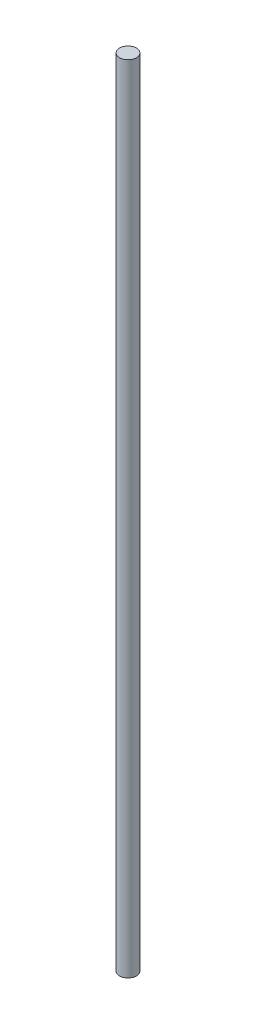
ISO-10303-21;
HEADER;
FILE_DESCRIPTION(('STEP AP214'),'2;1');
FILE_NAME('part.step','',(''),(''),'','','');
FILE_SCHEMA(('AUTOMOTIVE_DESIGN { 1 0 10303 214 1 1 1 1 }'));
ENDSEC;
DATA;
#1=APPLICATION_CONTEXT('core data for automotive mechanical design processes');
#2=APPLICATION_PROTOCOL_DEFINITION('international standard','automotive_design',2000,#1);
#3=PRODUCT_CONTEXT('',#1,'mechanical');
#4=PRODUCT('Part','Part','',(#3));
#5=PRODUCT_RELATED_PRODUCT_CATEGORY('part','',(#4));
#6=PRODUCT_DEFINITION_FORMATION('','',#4);
#7=PRODUCT_DEFINITION_CONTEXT('part definition',#1,'design');
#8=PRODUCT_DEFINITION('design','',#6,#7);
#9=PRODUCT_DEFINITION_SHAPE('','',#8);
#10=(LENGTH_UNIT() NAMED_UNIT(*) SI_UNIT(.MILLI.,.METRE.));
#11=(NAMED_UNIT(*) PLANE_ANGLE_UNIT() SI_UNIT($,.RADIAN.));
#12=(NAMED_UNIT(*) SI_UNIT($,.STERADIAN.) SOLID_ANGLE_UNIT());
#13=UNCERTAINTY_MEASURE_WITH_UNIT(LENGTH_MEASURE(1.E-05),#10,'distance_accuracy_value','');
#14=(GEOMETRIC_REPRESENTATION_CONTEXT(3) GLOBAL_UNCERTAINTY_ASSIGNED_CONTEXT((#13)) GLOBAL_UNIT_ASSIGNED_CONTEXT((#10,
#11,#12)) REPRESENTATION_CONTEXT('',''));
#15=CARTESIAN_POINT('',(0.,0.,0.));
#16=DIRECTION('',(0.,0.,1.));
#17=DIRECTION('',(1.,0.,0.));
#18=AXIS2_PLACEMENT_3D('',#15,#16,#17);
#19=CARTESIAN_POINT('',(-8.5683409021784,377.5,-5.41821557049514));
#20=DIRECTION('',(0.,-1.,0.));
#21=DIRECTION('',(0.,0.,-1.));
#22=AXIS2_PLACEMENT_3D('',#19,#20,#21);
#23=CYLINDRICAL_SURFACE('',#22,4.);
#24=CARTESIAN_POINT('',(-8.5683409021784,377.5,-5.41821557049514));
#25=DIRECTION('',(0.,1.,0.));
#26=DIRECTION('',(0.,0.,1.));
#27=AXIS2_PLACEMENT_3D('',#24,#25,#26);
#28=CIRCLE('',#27,4.);
#29=CARTESIAN_POINT('',(-8.5683409021784,377.5,-1.41821557049514));
#30=VERTEX_POINT('',#29);
#31=EDGE_CURVE('E10',#30,#30,#28,.T.);
#32=ORIENTED_EDGE('',*,*,#31,.F.);
#33=EDGE_LOOP('',(#32));
#34=FACE_BOUND('',#33,.T.);
#35=CARTESIAN_POINT('',(-8.5683409021784,0.,-5.41821557049514));
#36=DIRECTION('',(0.,1.,0.));
#37=DIRECTION('',(0.,0.,1.));
#38=AXIS2_PLACEMENT_3D('',#35,#36,#37);
#39=CIRCLE('',#38,4.);
#40=CARTESIAN_POINT('',(-8.5683409021784,0.,-1.41821557049514));
#41=VERTEX_POINT('',#40);
#42=EDGE_CURVE('E34',#41,#41,#39,.T.);
#43=ORIENTED_EDGE('',*,*,#42,.T.);
#44=EDGE_LOOP('',(#43));
#45=FACE_BOUND('',#44,.T.);
#46=ADVANCED_FACE('F31',(#34,#45),#23,.T.);
#47=CARTESIAN_POINT('',(-8.5683409021784,377.5,-5.41821557049514));
#48=DIRECTION('',(0.,1.,0.));
#49=DIRECTION('',(0.,0.,1.));
#50=AXIS2_PLACEMENT_3D('',#47,#48,#49);
#51=PLANE('',#50);
#52=ORIENTED_EDGE('',*,*,#31,.T.);
#53=EDGE_LOOP('',(#52));
#54=FACE_BOUND('',#53,.T.);
#55=ADVANCED_FACE('F46',(#54),#51,.T.);
#56=CARTESIAN_POINT('',(-8.5683409021784,0.,-5.41821557049514));
#57=DIRECTION('',(0.,1.,0.));
#58=DIRECTION('',(0.,0.,1.));
#59=AXIS2_PLACEMENT_3D('',#56,#57,#58);
#60=PLANE('',#59);
#61=ORIENTED_EDGE('',*,*,#42,.F.);
#62=EDGE_LOOP('',(#61));
#63=FACE_BOUND('',#62,.T.);
#64=ADVANCED_FACE('F44',(#63),#60,.F.);
#65=CLOSED_SHELL('',(#46,#55,#64));
#66=MANIFOLD_SOLID_BREP('B2',#65);
#67=ADVANCED_BREP_SHAPE_REPRESENTATION('',(#18,#66),#14);
#68=SHAPE_DEFINITION_REPRESENTATION(#9,#67);
ENDSEC;
END-ISO-10303-21;
